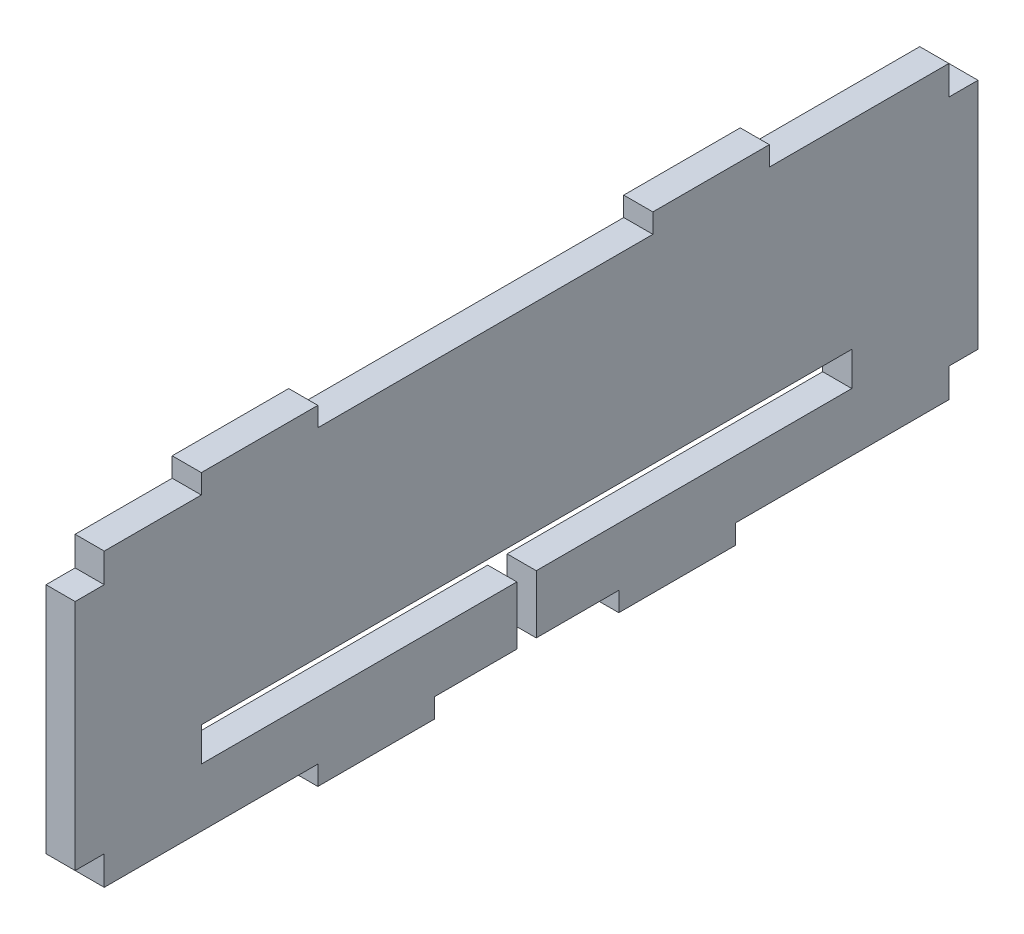
ISO-10303-21;
HEADER;
FILE_DESCRIPTION(('STEP AP214'),'2;1');
FILE_NAME('part.step','',(''),(''),'','','');
FILE_SCHEMA(('AUTOMOTIVE_DESIGN { 1 0 10303 214 1 1 1 1 }'));
ENDSEC;
DATA;
#1=APPLICATION_CONTEXT('core data for automotive mechanical design processes');
#2=APPLICATION_PROTOCOL_DEFINITION('international standard','automotive_design',2000,#1);
#3=PRODUCT_CONTEXT('',#1,'mechanical');
#4=PRODUCT('Part','Part','',(#3));
#5=PRODUCT_RELATED_PRODUCT_CATEGORY('part','',(#4));
#6=PRODUCT_DEFINITION_FORMATION('','',#4);
#7=PRODUCT_DEFINITION_CONTEXT('part definition',#1,'design');
#8=PRODUCT_DEFINITION('design','',#6,#7);
#9=PRODUCT_DEFINITION_SHAPE('','',#8);
#10=(LENGTH_UNIT() NAMED_UNIT(*) SI_UNIT(.MILLI.,.METRE.));
#11=(NAMED_UNIT(*) PLANE_ANGLE_UNIT() SI_UNIT($,.RADIAN.));
#12=(NAMED_UNIT(*) SI_UNIT($,.STERADIAN.) SOLID_ANGLE_UNIT());
#13=UNCERTAINTY_MEASURE_WITH_UNIT(LENGTH_MEASURE(1.E-05),#10,'distance_accuracy_value','');
#14=(GEOMETRIC_REPRESENTATION_CONTEXT(3) GLOBAL_UNCERTAINTY_ASSIGNED_CONTEXT((#13)) GLOBAL_UNIT_ASSIGNED_CONTEXT((#10,
#11,#12)) REPRESENTATION_CONTEXT('',''));
#15=CARTESIAN_POINT('',(0.,0.,0.));
#16=DIRECTION('',(0.,0.,1.));
#17=DIRECTION('',(1.,0.,0.));
#18=AXIS2_PLACEMENT_3D('',#15,#16,#17);
#19=CARTESIAN_POINT('',(3.,29.,0.));
#20=DIRECTION('',(0.,1.,0.));
#21=DIRECTION('',(0.,0.,1.));
#22=AXIS2_PLACEMENT_3D('',#19,#20,#21);
#23=PLANE('',#22);
#24=DIRECTION('',(0.,0.,-1.));
#25=VECTOR('',#24,1.);
#26=CARTESIAN_POINT('',(0.,29.,0.));
#27=LINE('',#26,#25);
#28=CARTESIAN_POINT('',(0.,29.,-90.));
#29=VERTEX_POINT('',#28);
#30=CARTESIAN_POINT('',(0.,29.,-93.));
#31=VERTEX_POINT('',#30);
#32=EDGE_CURVE('E294',#29,#31,#27,.T.);
#33=ORIENTED_EDGE('',*,*,#32,.F.);
#34=DIRECTION('',(-1.,0.,0.));
#35=VECTOR('',#34,1.);
#36=CARTESIAN_POINT('',(3.,29.,-90.));
#37=LINE('',#36,#35);
#38=CARTESIAN_POINT('',(3.,29.,-90.));
#39=VERTEX_POINT('',#38);
#40=EDGE_CURVE('E11',#39,#29,#37,.T.);
#41=ORIENTED_EDGE('',*,*,#40,.F.);
#42=DIRECTION('',(0.,0.,-1.));
#43=VECTOR('',#42,1.);
#44=CARTESIAN_POINT('',(3.,29.,0.));
#45=LINE('',#44,#43);
#46=CARTESIAN_POINT('',(3.,29.,-93.));
#47=VERTEX_POINT('',#46);
#48=EDGE_CURVE('E378',#39,#47,#45,.T.);
#49=ORIENTED_EDGE('',*,*,#48,.T.);
#50=DIRECTION('',(-1.,0.,0.));
#51=VECTOR('',#50,1.);
#52=CARTESIAN_POINT('',(3.,29.,-93.));
#53=LINE('',#52,#51);
#54=EDGE_CURVE('E169',#47,#31,#53,.T.);
#55=ORIENTED_EDGE('',*,*,#54,.T.);
#56=EDGE_LOOP('',(#33,#41,#49,#55));
#57=FACE_BOUND('',#56,.T.);
#58=ADVANCED_FACE('F34',(#57),#23,.T.);
#59=CARTESIAN_POINT('',(3.,0.,-90.));
#60=DIRECTION('',(0.,0.,-1.));
#61=DIRECTION('',(-1.,0.,0.));
#62=AXIS2_PLACEMENT_3D('',#59,#60,#61);
#63=PLANE('',#62);
#64=DIRECTION('',(0.,-1.,0.));
#65=VECTOR('',#64,1.);
#66=CARTESIAN_POINT('',(0.,0.,-90.));
#67=LINE('',#66,#65);
#68=CARTESIAN_POINT('',(0.,32.,-90.));
#69=VERTEX_POINT('',#68);
#70=EDGE_CURVE('E297',#69,#29,#67,.T.);
#71=ORIENTED_EDGE('',*,*,#70,.F.);
#72=DIRECTION('',(-1.,0.,0.));
#73=VECTOR('',#72,1.);
#74=CARTESIAN_POINT('',(3.,32.,-90.));
#75=LINE('',#74,#73);
#76=CARTESIAN_POINT('',(3.,32.,-90.));
#77=VERTEX_POINT('',#76);
#78=EDGE_CURVE('E42',#77,#69,#75,.T.);
#79=ORIENTED_EDGE('',*,*,#78,.F.);
#80=DIRECTION('',(0.,-1.,0.));
#81=VECTOR('',#80,1.);
#82=CARTESIAN_POINT('',(3.,0.,-90.));
#83=LINE('',#82,#81);
#84=EDGE_CURVE('E478',#77,#39,#83,.T.);
#85=ORIENTED_EDGE('',*,*,#84,.T.);
#86=ORIENTED_EDGE('',*,*,#40,.T.);
#87=EDGE_LOOP('',(#71,#79,#85,#86));
#88=FACE_BOUND('',#87,.T.);
#89=ADVANCED_FACE('F466',(#88),#63,.T.);
#90=CARTESIAN_POINT('',(3.,32.,0.));
#91=DIRECTION('',(0.,1.,0.));
#92=DIRECTION('',(0.,0.,1.));
#93=AXIS2_PLACEMENT_3D('',#90,#91,#92);
#94=PLANE('',#93);
#95=DIRECTION('',(0.,0.,-1.));
#96=VECTOR('',#95,1.);
#97=CARTESIAN_POINT('',(0.,32.,0.));
#98=LINE('',#97,#96);
#99=CARTESIAN_POINT('',(0.,32.,-71.51));
#100=VERTEX_POINT('',#99);
#101=EDGE_CURVE('E300',#100,#69,#98,.T.);
#102=ORIENTED_EDGE('',*,*,#101,.F.);
#103=DIRECTION('',(-1.,0.,0.));
#104=VECTOR('',#103,1.);
#105=CARTESIAN_POINT('',(3.,32.,-71.51));
#106=LINE('',#105,#104);
#107=CARTESIAN_POINT('',(3.,32.,-71.51));
#108=VERTEX_POINT('',#107);
#109=EDGE_CURVE('E455',#108,#100,#106,.T.);
#110=ORIENTED_EDGE('',*,*,#109,.F.);
#111=DIRECTION('',(0.,0.,-1.));
#112=VECTOR('',#111,1.);
#113=CARTESIAN_POINT('',(3.,32.,0.));
#114=LINE('',#113,#112);
#115=EDGE_CURVE('E462',#108,#77,#114,.T.);
#116=ORIENTED_EDGE('',*,*,#115,.T.);
#117=ORIENTED_EDGE('',*,*,#78,.T.);
#118=EDGE_LOOP('',(#102,#110,#116,#117));
#119=FACE_BOUND('',#118,.T.);
#120=ADVANCED_FACE('F460',(#119),#94,.T.);
#121=CARTESIAN_POINT('',(3.,0.,-71.51));
#122=DIRECTION('',(0.,0.,-1.));
#123=DIRECTION('',(-1.,0.,0.));
#124=AXIS2_PLACEMENT_3D('',#121,#122,#123);
#125=PLANE('',#124);
#126=DIRECTION('',(0.,-1.,0.));
#127=VECTOR('',#126,1.);
#128=CARTESIAN_POINT('',(0.,0.,-71.51));
#129=LINE('',#128,#127);
#130=CARTESIAN_POINT('',(0.,34.,-71.51));
#131=VERTEX_POINT('',#130);
#132=EDGE_CURVE('E303',#131,#100,#129,.T.);
#133=ORIENTED_EDGE('',*,*,#132,.F.);
#134=DIRECTION('',(-1.,0.,0.));
#135=VECTOR('',#134,1.);
#136=CARTESIAN_POINT('',(3.,34.,-71.51));
#137=LINE('',#136,#135);
#138=CARTESIAN_POINT('',(3.,34.,-71.51));
#139=VERTEX_POINT('',#138);
#140=EDGE_CURVE('E453',#139,#131,#137,.T.);
#141=ORIENTED_EDGE('',*,*,#140,.F.);
#142=DIRECTION('',(0.,-1.,0.));
#143=VECTOR('',#142,1.);
#144=CARTESIAN_POINT('',(3.,0.,-71.51));
#145=LINE('',#144,#143);
#146=EDGE_CURVE('E475',#139,#108,#145,.T.);
#147=ORIENTED_EDGE('',*,*,#146,.T.);
#148=ORIENTED_EDGE('',*,*,#109,.T.);
#149=EDGE_LOOP('',(#133,#141,#147,#148));
#150=FACE_BOUND('',#149,.T.);
#151=ADVANCED_FACE('F472',(#150),#125,.T.);
#152=CARTESIAN_POINT('',(3.,34.,0.));
#153=DIRECTION('',(0.,1.,0.));
#154=DIRECTION('',(0.,0.,1.));
#155=AXIS2_PLACEMENT_3D('',#152,#153,#154);
#156=PLANE('',#155);
#157=DIRECTION('',(0.,0.,-1.));
#158=VECTOR('',#157,1.);
#159=CARTESIAN_POINT('',(0.,34.,0.));
#160=LINE('',#159,#158);
#161=CARTESIAN_POINT('',(0.,34.,-59.51));
#162=VERTEX_POINT('',#161);
#163=EDGE_CURVE('E306',#162,#131,#160,.T.);
#164=ORIENTED_EDGE('',*,*,#163,.F.);
#165=DIRECTION('',(-1.,0.,0.));
#166=VECTOR('',#165,1.);
#167=CARTESIAN_POINT('',(3.,34.,-59.51));
#168=LINE('',#167,#166);
#169=CARTESIAN_POINT('',(3.,34.,-59.51));
#170=VERTEX_POINT('',#169);
#171=EDGE_CURVE('E451',#170,#162,#168,.T.);
#172=ORIENTED_EDGE('',*,*,#171,.F.);
#173=DIRECTION('',(0.,0.,-1.));
#174=VECTOR('',#173,1.);
#175=CARTESIAN_POINT('',(3.,34.,0.));
#176=LINE('',#175,#174);
#177=EDGE_CURVE('E480',#170,#139,#176,.T.);
#178=ORIENTED_EDGE('',*,*,#177,.T.);
#179=ORIENTED_EDGE('',*,*,#140,.T.);
#180=EDGE_LOOP('',(#164,#172,#178,#179));
#181=FACE_BOUND('',#180,.T.);
#182=ADVANCED_FACE('F576',(#181),#156,.T.);
#183=CARTESIAN_POINT('',(3.,0.,-59.51));
#184=DIRECTION('',(0.,0.,1.));
#185=DIRECTION('',(1.,0.,0.));
#186=AXIS2_PLACEMENT_3D('',#183,#184,#185);
#187=PLANE('',#186);
#188=DIRECTION('',(0.,1.,0.));
#189=VECTOR('',#188,1.);
#190=CARTESIAN_POINT('',(0.,0.,-59.51));
#191=LINE('',#190,#189);
#192=CARTESIAN_POINT('',(0.,32.,-59.51));
#193=VERTEX_POINT('',#192);
#194=EDGE_CURVE('E309',#193,#162,#191,.T.);
#195=ORIENTED_EDGE('',*,*,#194,.F.);
#196=DIRECTION('',(-1.,0.,0.));
#197=VECTOR('',#196,1.);
#198=CARTESIAN_POINT('',(3.,32.,-59.51));
#199=LINE('',#198,#197);
#200=CARTESIAN_POINT('',(3.,32.,-59.51));
#201=VERTEX_POINT('',#200);
#202=EDGE_CURVE('E449',#201,#193,#199,.T.);
#203=ORIENTED_EDGE('',*,*,#202,.F.);
#204=DIRECTION('',(0.,1.,0.));
#205=VECTOR('',#204,1.);
#206=CARTESIAN_POINT('',(3.,0.,-59.51));
#207=LINE('',#206,#205);
#208=EDGE_CURVE('E486',#201,#170,#207,.T.);
#209=ORIENTED_EDGE('',*,*,#208,.T.);
#210=ORIENTED_EDGE('',*,*,#171,.T.);
#211=EDGE_LOOP('',(#195,#203,#209,#210));
#212=FACE_BOUND('',#211,.T.);
#213=ADVANCED_FACE('F577',(#212),#187,.T.);
#214=CARTESIAN_POINT('',(3.,32.,0.));
#215=DIRECTION('',(0.,1.,0.));
#216=DIRECTION('',(0.,0.,1.));
#217=AXIS2_PLACEMENT_3D('',#214,#215,#216);
#218=PLANE('',#217);
#219=DIRECTION('',(0.,0.,-1.));
#220=VECTOR('',#219,1.);
#221=CARTESIAN_POINT('',(0.,32.,0.));
#222=LINE('',#221,#220);
#223=CARTESIAN_POINT('',(0.,32.,-25.));
#224=VERTEX_POINT('',#223);
#225=EDGE_CURVE('E313',#224,#193,#222,.T.);
#226=ORIENTED_EDGE('',*,*,#225,.F.);
#227=DIRECTION('',(-1.,0.,0.));
#228=VECTOR('',#227,1.);
#229=CARTESIAN_POINT('',(3.,32.,-25.));
#230=LINE('',#229,#228);
#231=CARTESIAN_POINT('',(3.,32.,-25.));
#232=VERTEX_POINT('',#231);
#233=EDGE_CURVE('E447',#232,#224,#230,.T.);
#234=ORIENTED_EDGE('',*,*,#233,.F.);
#235=DIRECTION('',(0.,0.,-1.));
#236=VECTOR('',#235,1.);
#237=CARTESIAN_POINT('',(3.,32.,0.));
#238=LINE('',#237,#236);
#239=EDGE_CURVE('E490',#232,#201,#238,.T.);
#240=ORIENTED_EDGE('',*,*,#239,.T.);
#241=ORIENTED_EDGE('',*,*,#202,.T.);
#242=EDGE_LOOP('',(#226,#234,#240,#241));
#243=FACE_BOUND('',#242,.T.);
#244=ADVANCED_FACE('F580',(#243),#218,.T.);
#245=CARTESIAN_POINT('',(3.,0.,-25.));
#246=DIRECTION('',(0.,0.,-1.));
#247=DIRECTION('',(-1.,0.,0.));
#248=AXIS2_PLACEMENT_3D('',#245,#246,#247);
#249=PLANE('',#248);
#250=DIRECTION('',(0.,-1.,0.));
#251=VECTOR('',#250,1.);
#252=CARTESIAN_POINT('',(0.,0.,-25.));
#253=LINE('',#252,#251);
#254=CARTESIAN_POINT('',(0.,34.,-25.));
#255=VERTEX_POINT('',#254);
#256=EDGE_CURVE('E316',#255,#224,#253,.T.);
#257=ORIENTED_EDGE('',*,*,#256,.F.);
#258=DIRECTION('',(-1.,0.,0.));
#259=VECTOR('',#258,1.);
#260=CARTESIAN_POINT('',(3.,34.,-25.));
#261=LINE('',#260,#259);
#262=CARTESIAN_POINT('',(3.,34.,-25.));
#263=VERTEX_POINT('',#262);
#264=EDGE_CURVE('E445',#263,#255,#261,.T.);
#265=ORIENTED_EDGE('',*,*,#264,.F.);
#266=DIRECTION('',(0.,-1.,0.));
#267=VECTOR('',#266,1.);
#268=CARTESIAN_POINT('',(3.,0.,-25.));
#269=LINE('',#268,#267);
#270=EDGE_CURVE('E493',#263,#232,#269,.T.);
#271=ORIENTED_EDGE('',*,*,#270,.T.);
#272=ORIENTED_EDGE('',*,*,#233,.T.);
#273=EDGE_LOOP('',(#257,#265,#271,#272));
#274=FACE_BOUND('',#273,.T.);
#275=ADVANCED_FACE('F584',(#274),#249,.T.);
#276=CARTESIAN_POINT('',(0.,34.,-13.));
#277=VERTEX_POINT('',#276);
#278=EDGE_CURVE('E310',#277,#255,#160,.T.);
#279=ORIENTED_EDGE('',*,*,#278,.F.);
#280=DIRECTION('',(-1.,0.,0.));
#281=VECTOR('',#280,1.);
#282=CARTESIAN_POINT('',(3.,34.,-13.));
#283=LINE('',#282,#281);
#284=CARTESIAN_POINT('',(3.,34.,-13.));
#285=VERTEX_POINT('',#284);
#286=EDGE_CURVE('E443',#285,#277,#283,.T.);
#287=ORIENTED_EDGE('',*,*,#286,.F.);
#288=EDGE_CURVE('E487',#285,#263,#176,.T.);
#289=ORIENTED_EDGE('',*,*,#288,.T.);
#290=ORIENTED_EDGE('',*,*,#264,.T.);
#291=EDGE_LOOP('',(#279,#287,#289,#290));
#292=FACE_BOUND('',#291,.T.);
#293=ADVANCED_FACE('F588',(#292),#156,.T.);
#294=CARTESIAN_POINT('',(3.,0.,-13.));
#295=DIRECTION('',(0.,0.,1.));
#296=DIRECTION('',(1.,0.,0.));
#297=AXIS2_PLACEMENT_3D('',#294,#295,#296);
#298=PLANE('',#297);
#299=DIRECTION('',(0.,1.,0.));
#300=VECTOR('',#299,1.);
#301=CARTESIAN_POINT('',(0.,0.,-13.));
#302=LINE('',#301,#300);
#303=CARTESIAN_POINT('',(0.,32.,-13.));
#304=VERTEX_POINT('',#303);
#305=EDGE_CURVE('E319',#304,#277,#302,.T.);
#306=ORIENTED_EDGE('',*,*,#305,.F.);
#307=DIRECTION('',(-1.,0.,0.));
#308=VECTOR('',#307,1.);
#309=CARTESIAN_POINT('',(3.,32.,-13.));
#310=LINE('',#309,#308);
#311=CARTESIAN_POINT('',(3.,32.,-13.));
#312=VERTEX_POINT('',#311);
#313=EDGE_CURVE('E441',#312,#304,#310,.T.);
#314=ORIENTED_EDGE('',*,*,#313,.F.);
#315=DIRECTION('',(0.,1.,0.));
#316=VECTOR('',#315,1.);
#317=CARTESIAN_POINT('',(3.,0.,-13.));
#318=LINE('',#317,#316);
#319=EDGE_CURVE('E496',#312,#285,#318,.T.);
#320=ORIENTED_EDGE('',*,*,#319,.T.);
#321=ORIENTED_EDGE('',*,*,#286,.T.);
#322=EDGE_LOOP('',(#306,#314,#320,#321));
#323=FACE_BOUND('',#322,.T.);
#324=ADVANCED_FACE('F592',(#323),#298,.T.);
#325=CARTESIAN_POINT('',(3.,32.,0.));
#326=DIRECTION('',(0.,1.,0.));
#327=DIRECTION('',(0.,0.,1.));
#328=AXIS2_PLACEMENT_3D('',#325,#326,#327);
#329=PLANE('',#328);
#330=DIRECTION('',(0.,0.,-1.));
#331=VECTOR('',#330,1.);
#332=CARTESIAN_POINT('',(0.,32.,0.));
#333=LINE('',#332,#331);
#334=CARTESIAN_POINT('',(0.,32.,-2.99999999999999));
#335=VERTEX_POINT('',#334);
#336=EDGE_CURVE('E322',#335,#304,#333,.T.);
#337=ORIENTED_EDGE('',*,*,#336,.F.);
#338=DIRECTION('',(-1.,0.,0.));
#339=VECTOR('',#338,1.);
#340=CARTESIAN_POINT('',(3.,32.,-2.99999999999999));
#341=LINE('',#340,#339);
#342=CARTESIAN_POINT('',(3.,32.,-2.99999999999999));
#343=VERTEX_POINT('',#342);
#344=EDGE_CURVE('E439',#343,#335,#341,.T.);
#345=ORIENTED_EDGE('',*,*,#344,.F.);
#346=DIRECTION('',(0.,0.,-1.));
#347=VECTOR('',#346,1.);
#348=CARTESIAN_POINT('',(3.,32.,0.));
#349=LINE('',#348,#347);
#350=EDGE_CURVE('E499',#343,#312,#349,.T.);
#351=ORIENTED_EDGE('',*,*,#350,.T.);
#352=ORIENTED_EDGE('',*,*,#313,.T.);
#353=EDGE_LOOP('',(#337,#345,#351,#352));
#354=FACE_BOUND('',#353,.T.);
#355=ADVANCED_FACE('F596',(#354),#329,.T.);
#356=CARTESIAN_POINT('',(3.,0.,-2.99999999999999));
#357=DIRECTION('',(0.,0.,1.));
#358=DIRECTION('',(1.,0.,0.));
#359=AXIS2_PLACEMENT_3D('',#356,#357,#358);
#360=PLANE('',#359);
#361=DIRECTION('',(0.,1.,0.));
#362=VECTOR('',#361,1.);
#363=CARTESIAN_POINT('',(0.,0.,-2.99999999999999));
#364=LINE('',#363,#362);
#365=CARTESIAN_POINT('',(0.,29.,-2.99999999999999));
#366=VERTEX_POINT('',#365);
#367=EDGE_CURVE('E325',#366,#335,#364,.T.);
#368=ORIENTED_EDGE('',*,*,#367,.F.);
#369=DIRECTION('',(-1.,0.,0.));
#370=VECTOR('',#369,1.);
#371=CARTESIAN_POINT('',(3.,29.,-2.99999999999999));
#372=LINE('',#371,#370);
#373=CARTESIAN_POINT('',(3.,29.,-2.99999999999999));
#374=VERTEX_POINT('',#373);
#375=EDGE_CURVE('E437',#374,#366,#372,.T.);
#376=ORIENTED_EDGE('',*,*,#375,.F.);
#377=DIRECTION('',(0.,1.,0.));
#378=VECTOR('',#377,1.);
#379=CARTESIAN_POINT('',(3.,0.,-2.99999999999999));
#380=LINE('',#379,#378);
#381=EDGE_CURVE('E502',#374,#343,#380,.T.);
#382=ORIENTED_EDGE('',*,*,#381,.T.);
#383=ORIENTED_EDGE('',*,*,#344,.T.);
#384=EDGE_LOOP('',(#368,#376,#382,#383));
#385=FACE_BOUND('',#384,.T.);
#386=ADVANCED_FACE('F600',(#385),#360,.T.);
#387=CARTESIAN_POINT('',(3.,29.,0.));
#388=DIRECTION('',(0.,1.,0.));
#389=DIRECTION('',(0.,0.,1.));
#390=AXIS2_PLACEMENT_3D('',#387,#388,#389);
#391=PLANE('',#390);
#392=DIRECTION('',(0.,0.,-1.));
#393=VECTOR('',#392,1.);
#394=CARTESIAN_POINT('',(0.,29.,0.));
#395=LINE('',#394,#393);
#396=CARTESIAN_POINT('',(0.,29.,0.));
#397=VERTEX_POINT('',#396);
#398=EDGE_CURVE('E328',#397,#366,#395,.T.);
#399=ORIENTED_EDGE('',*,*,#398,.F.);
#400=DIRECTION('',(-1.,0.,0.));
#401=VECTOR('',#400,1.);
#402=CARTESIAN_POINT('',(3.,29.,0.));
#403=LINE('',#402,#401);
#404=CARTESIAN_POINT('',(3.,29.,0.));
#405=VERTEX_POINT('',#404);
#406=EDGE_CURVE('E435',#405,#397,#403,.T.);
#407=ORIENTED_EDGE('',*,*,#406,.F.);
#408=DIRECTION('',(0.,0.,-1.));
#409=VECTOR('',#408,1.);
#410=CARTESIAN_POINT('',(3.,29.,0.));
#411=LINE('',#410,#409);
#412=EDGE_CURVE('E505',#405,#374,#411,.T.);
#413=ORIENTED_EDGE('',*,*,#412,.T.);
#414=ORIENTED_EDGE('',*,*,#375,.T.);
#415=EDGE_LOOP('',(#399,#407,#413,#414));
#416=FACE_BOUND('',#415,.T.);
#417=ADVANCED_FACE('F604',(#416),#391,.T.);
#418=CARTESIAN_POINT('',(3.,0.,0.));
#419=DIRECTION('',(0.,0.,-1.));
#420=DIRECTION('',(-1.,0.,0.));
#421=AXIS2_PLACEMENT_3D('',#418,#419,#420);
#422=PLANE('',#421);
#423=DIRECTION('',(0.,-1.,0.));
#424=VECTOR('',#423,1.);
#425=CARTESIAN_POINT('',(0.,0.,0.));
#426=LINE('',#425,#424);
#427=CARTESIAN_POINT('',(0.,5.,0.));
#428=VERTEX_POINT('',#427);
#429=EDGE_CURVE('E331',#397,#428,#426,.T.);
#430=ORIENTED_EDGE('',*,*,#429,.T.);
#431=DIRECTION('',(-1.,0.,0.));
#432=VECTOR('',#431,1.);
#433=CARTESIAN_POINT('',(3.,5.,0.));
#434=LINE('',#433,#432);
#435=CARTESIAN_POINT('',(3.,5.,0.));
#436=VERTEX_POINT('',#435);
#437=EDGE_CURVE('E432',#436,#428,#434,.T.);
#438=ORIENTED_EDGE('',*,*,#437,.F.);
#439=DIRECTION('',(0.,-1.,0.));
#440=VECTOR('',#439,1.);
#441=CARTESIAN_POINT('',(3.,0.,0.));
#442=LINE('',#441,#440);
#443=EDGE_CURVE('E508',#405,#436,#442,.T.);
#444=ORIENTED_EDGE('',*,*,#443,.F.);
#445=ORIENTED_EDGE('',*,*,#406,.T.);
#446=EDGE_LOOP('',(#430,#438,#444,#445));
#447=FACE_BOUND('',#446,.T.);
#448=ADVANCED_FACE('F608',(#447),#422,.F.);
#449=CARTESIAN_POINT('',(3.,5.,0.));
#450=DIRECTION('',(0.,1.,0.));
#451=DIRECTION('',(0.,0.,1.));
#452=AXIS2_PLACEMENT_3D('',#449,#450,#451);
#453=PLANE('',#452);
#454=DIRECTION('',(0.,0.,-1.));
#455=VECTOR('',#454,1.);
#456=CARTESIAN_POINT('',(0.,5.,0.));
#457=LINE('',#456,#455);
#458=CARTESIAN_POINT('',(0.,5.,-3.));
#459=VERTEX_POINT('',#458);
#460=EDGE_CURVE('E333',#428,#459,#457,.T.);
#461=ORIENTED_EDGE('',*,*,#460,.T.);
#462=DIRECTION('',(-1.,0.,0.));
#463=VECTOR('',#462,1.);
#464=CARTESIAN_POINT('',(3.,5.,-3.));
#465=LINE('',#464,#463);
#466=CARTESIAN_POINT('',(3.,5.,-3.));
#467=VERTEX_POINT('',#466);
#468=EDGE_CURVE('E429',#467,#459,#465,.T.);
#469=ORIENTED_EDGE('',*,*,#468,.F.);
#470=DIRECTION('',(0.,0.,-1.));
#471=VECTOR('',#470,1.);
#472=CARTESIAN_POINT('',(3.,5.,0.));
#473=LINE('',#472,#471);
#474=EDGE_CURVE('E510',#436,#467,#473,.T.);
#475=ORIENTED_EDGE('',*,*,#474,.F.);
#476=ORIENTED_EDGE('',*,*,#437,.T.);
#477=EDGE_LOOP('',(#461,#469,#475,#476));
#478=FACE_BOUND('',#477,.T.);
#479=ADVANCED_FACE('F612',(#478),#453,.F.);
#480=CARTESIAN_POINT('',(3.,0.,-3.));
#481=DIRECTION('',(0.,0.,-1.));
#482=DIRECTION('',(0.,1.,0.));
#483=AXIS2_PLACEMENT_3D('',#480,#481,#482);
#484=PLANE('',#483);
#485=DIRECTION('',(0.,-1.,0.));
#486=VECTOR('',#485,1.);
#487=CARTESIAN_POINT('',(0.,0.,-3.));
#488=LINE('',#487,#486);
#489=CARTESIAN_POINT('',(0.,2.,-3.));
#490=VERTEX_POINT('',#489);
#491=EDGE_CURVE('E335',#459,#490,#488,.T.);
#492=ORIENTED_EDGE('',*,*,#491,.T.);
#493=DIRECTION('',(-1.,0.,0.));
#494=VECTOR('',#493,1.);
#495=CARTESIAN_POINT('',(3.,2.,-3.));
#496=LINE('',#495,#494);
#497=CARTESIAN_POINT('',(3.,2.,-3.));
#498=VERTEX_POINT('',#497);
#499=EDGE_CURVE('E426',#498,#490,#496,.T.);
#500=ORIENTED_EDGE('',*,*,#499,.F.);
#501=DIRECTION('',(0.,-1.,0.));
#502=VECTOR('',#501,1.);
#503=CARTESIAN_POINT('',(3.,0.,-3.));
#504=LINE('',#503,#502);
#505=EDGE_CURVE('E512',#467,#498,#504,.T.);
#506=ORIENTED_EDGE('',*,*,#505,.F.);
#507=ORIENTED_EDGE('',*,*,#468,.T.);
#508=EDGE_LOOP('',(#492,#500,#506,#507));
#509=FACE_BOUND('',#508,.T.);
#510=ADVANCED_FACE('F616',(#509),#484,.F.);
#511=CARTESIAN_POINT('',(3.,2.,0.));
#512=DIRECTION('',(0.,1.,0.));
#513=DIRECTION('',(0.,0.,1.));
#514=AXIS2_PLACEMENT_3D('',#511,#512,#513);
#515=PLANE('',#514);
#516=DIRECTION('',(0.,0.,-1.));
#517=VECTOR('',#516,1.);
#518=CARTESIAN_POINT('',(0.,2.,0.));
#519=LINE('',#518,#517);
#520=CARTESIAN_POINT('',(0.,2.,-25.));
#521=VERTEX_POINT('',#520);
#522=EDGE_CURVE('E337',#490,#521,#519,.T.);
#523=ORIENTED_EDGE('',*,*,#522,.T.);
#524=DIRECTION('',(-1.,0.,0.));
#525=VECTOR('',#524,1.);
#526=CARTESIAN_POINT('',(3.,2.,-25.));
#527=LINE('',#526,#525);
#528=CARTESIAN_POINT('',(3.,2.,-25.));
#529=VERTEX_POINT('',#528);
#530=EDGE_CURVE('E423',#529,#521,#527,.T.);
#531=ORIENTED_EDGE('',*,*,#530,.F.);
#532=DIRECTION('',(0.,0.,-1.));
#533=VECTOR('',#532,1.);
#534=CARTESIAN_POINT('',(3.,2.,0.));
#535=LINE('',#534,#533);
#536=EDGE_CURVE('E514',#498,#529,#535,.T.);
#537=ORIENTED_EDGE('',*,*,#536,.F.);
#538=ORIENTED_EDGE('',*,*,#499,.T.);
#539=EDGE_LOOP('',(#523,#531,#537,#538));
#540=FACE_BOUND('',#539,.T.);
#541=ADVANCED_FACE('F620',(#540),#515,.F.);
#542=CARTESIAN_POINT('',(3.,0.,-25.));
#543=DIRECTION('',(0.,0.,-1.));
#544=DIRECTION('',(-1.,0.,0.));
#545=AXIS2_PLACEMENT_3D('',#542,#543,#544);
#546=PLANE('',#545);
#547=DIRECTION('',(0.,-1.,0.));
#548=VECTOR('',#547,1.);
#549=CARTESIAN_POINT('',(0.,0.,-25.));
#550=LINE('',#549,#548);
#551=CARTESIAN_POINT('',(0.,0.,-25.));
#552=VERTEX_POINT('',#551);
#553=EDGE_CURVE('E339',#521,#552,#550,.T.);
#554=ORIENTED_EDGE('',*,*,#553,.T.);
#555=DIRECTION('',(-1.,0.,0.));
#556=VECTOR('',#555,1.);
#557=CARTESIAN_POINT('',(3.,0.,-25.));
#558=LINE('',#557,#556);
#559=CARTESIAN_POINT('',(3.,0.,-25.));
#560=VERTEX_POINT('',#559);
#561=EDGE_CURVE('E420',#560,#552,#558,.T.);
#562=ORIENTED_EDGE('',*,*,#561,.F.);
#563=DIRECTION('',(0.,-1.,0.));
#564=VECTOR('',#563,1.);
#565=CARTESIAN_POINT('',(3.,0.,-25.));
#566=LINE('',#565,#564);
#567=EDGE_CURVE('E516',#529,#560,#566,.T.);
#568=ORIENTED_EDGE('',*,*,#567,.F.);
#569=ORIENTED_EDGE('',*,*,#530,.T.);
#570=EDGE_LOOP('',(#554,#562,#568,#569));
#571=FACE_BOUND('',#570,.T.);
#572=ADVANCED_FACE('F624',(#571),#546,.F.);
#573=CARTESIAN_POINT('',(3.,0.,0.));
#574=DIRECTION('',(0.,1.,0.));
#575=DIRECTION('',(0.,0.,1.));
#576=AXIS2_PLACEMENT_3D('',#573,#574,#575);
#577=PLANE('',#576);
#578=DIRECTION('',(0.,0.,-1.));
#579=VECTOR('',#578,1.);
#580=CARTESIAN_POINT('',(0.,0.,0.));
#581=LINE('',#580,#579);
#582=CARTESIAN_POINT('',(0.,0.,-37.));
#583=VERTEX_POINT('',#582);
#584=EDGE_CURVE('E341',#552,#583,#581,.T.);
#585=ORIENTED_EDGE('',*,*,#584,.T.);
#586=DIRECTION('',(-1.,0.,0.));
#587=VECTOR('',#586,1.);
#588=CARTESIAN_POINT('',(3.,0.,-37.));
#589=LINE('',#588,#587);
#590=CARTESIAN_POINT('',(3.,0.,-37.));
#591=VERTEX_POINT('',#590);
#592=EDGE_CURVE('E417',#591,#583,#589,.T.);
#593=ORIENTED_EDGE('',*,*,#592,.F.);
#594=DIRECTION('',(0.,0.,-1.));
#595=VECTOR('',#594,1.);
#596=CARTESIAN_POINT('',(3.,0.,0.));
#597=LINE('',#596,#595);
#598=EDGE_CURVE('E518',#560,#591,#597,.T.);
#599=ORIENTED_EDGE('',*,*,#598,.F.);
#600=ORIENTED_EDGE('',*,*,#561,.T.);
#601=EDGE_LOOP('',(#585,#593,#599,#600));
#602=FACE_BOUND('',#601,.T.);
#603=ADVANCED_FACE('F628',(#602),#577,.F.);
#604=CARTESIAN_POINT('',(3.,0.,-37.));
#605=DIRECTION('',(0.,0.,1.));
#606=DIRECTION('',(1.,0.,0.));
#607=AXIS2_PLACEMENT_3D('',#604,#605,#606);
#608=PLANE('',#607);
#609=DIRECTION('',(0.,1.,0.));
#610=VECTOR('',#609,1.);
#611=CARTESIAN_POINT('',(0.,0.,-37.));
#612=LINE('',#611,#610);
#613=CARTESIAN_POINT('',(0.,2.,-37.));
#614=VERTEX_POINT('',#613);
#615=EDGE_CURVE('E343',#583,#614,#612,.T.);
#616=ORIENTED_EDGE('',*,*,#615,.T.);
#617=DIRECTION('',(-1.,0.,0.));
#618=VECTOR('',#617,1.);
#619=CARTESIAN_POINT('',(3.,2.,-37.));
#620=LINE('',#619,#618);
#621=CARTESIAN_POINT('',(3.,2.,-37.));
#622=VERTEX_POINT('',#621);
#623=EDGE_CURVE('E415',#622,#614,#620,.T.);
#624=ORIENTED_EDGE('',*,*,#623,.F.);
#625=DIRECTION('',(0.,1.,0.));
#626=VECTOR('',#625,1.);
#627=CARTESIAN_POINT('',(3.,0.,-37.));
#628=LINE('',#627,#626);
#629=EDGE_CURVE('E520',#591,#622,#628,.T.);
#630=ORIENTED_EDGE('',*,*,#629,.F.);
#631=ORIENTED_EDGE('',*,*,#592,.T.);
#632=EDGE_LOOP('',(#616,#624,#630,#631));
#633=FACE_BOUND('',#632,.T.);
#634=ADVANCED_FACE('F630',(#633),#608,.F.);
#635=CARTESIAN_POINT('',(3.,2.,0.));
#636=DIRECTION('',(0.,-1.,0.));
#637=DIRECTION('',(0.,0.,-1.));
#638=AXIS2_PLACEMENT_3D('',#635,#636,#637);
#639=PLANE('',#638);
#640=DIRECTION('',(0.,0.,1.));
#641=VECTOR('',#640,1.);
#642=CARTESIAN_POINT('',(0.,2.,0.));
#643=LINE('',#642,#641);
#644=CARTESIAN_POINT('',(0.,2.,-45.5));
#645=VERTEX_POINT('',#644);
#646=EDGE_CURVE('E347',#645,#614,#643,.T.);
#647=ORIENTED_EDGE('',*,*,#646,.F.);
#648=DIRECTION('',(-1.,0.,0.));
#649=VECTOR('',#648,1.);
#650=CARTESIAN_POINT('',(3.,2.,-45.5));
#651=LINE('',#650,#649);
#652=CARTESIAN_POINT('',(3.,2.,-45.5));
#653=VERTEX_POINT('',#652);
#654=EDGE_CURVE('E413',#653,#645,#651,.T.);
#655=ORIENTED_EDGE('',*,*,#654,.F.);
#656=DIRECTION('',(0.,0.,1.));
#657=VECTOR('',#656,1.);
#658=CARTESIAN_POINT('',(3.,2.,0.));
#659=LINE('',#658,#657);
#660=EDGE_CURVE('E523',#653,#622,#659,.T.);
#661=ORIENTED_EDGE('',*,*,#660,.T.);
#662=ORIENTED_EDGE('',*,*,#623,.T.);
#663=EDGE_LOOP('',(#647,#655,#661,#662));
#664=FACE_BOUND('',#663,.T.);
#665=ADVANCED_FACE('F633',(#664),#639,.T.);
#666=CARTESIAN_POINT('',(3.,0.,-45.5));
#667=DIRECTION('',(0.,0.,-1.));
#668=DIRECTION('',(-1.,0.,0.));
#669=AXIS2_PLACEMENT_3D('',#666,#667,#668);
#670=PLANE('',#669);
#671=DIRECTION('',(0.,-1.,0.));
#672=VECTOR('',#671,1.);
#673=CARTESIAN_POINT('',(0.,0.,-45.5));
#674=LINE('',#673,#672);
#675=CARTESIAN_POINT('',(0.,8.,-45.5));
#676=VERTEX_POINT('',#675);
#677=EDGE_CURVE('E350',#676,#645,#674,.T.);
#678=ORIENTED_EDGE('',*,*,#677,.F.);
#679=DIRECTION('',(-1.,0.,0.));
#680=VECTOR('',#679,1.);
#681=CARTESIAN_POINT('',(3.,8.,-45.5));
#682=LINE('',#681,#680);
#683=CARTESIAN_POINT('',(3.,8.,-45.5));
#684=VERTEX_POINT('',#683);
#685=EDGE_CURVE('E411',#684,#676,#682,.T.);
#686=ORIENTED_EDGE('',*,*,#685,.F.);
#687=DIRECTION('',(0.,-1.,0.));
#688=VECTOR('',#687,1.);
#689=CARTESIAN_POINT('',(3.,0.,-45.5));
#690=LINE('',#689,#688);
#691=EDGE_CURVE('E526',#684,#653,#690,.T.);
#692=ORIENTED_EDGE('',*,*,#691,.T.);
#693=ORIENTED_EDGE('',*,*,#654,.T.);
#694=EDGE_LOOP('',(#678,#686,#692,#693));
#695=FACE_BOUND('',#694,.T.);
#696=ADVANCED_FACE('F637',(#695),#670,.T.);
#697=CARTESIAN_POINT('',(3.,8.,0.));
#698=DIRECTION('',(0.,1.,0.));
#699=DIRECTION('',(0.,0.,1.));
#700=AXIS2_PLACEMENT_3D('',#697,#698,#699);
#701=PLANE('',#700);
#702=DIRECTION('',(0.,0.,-1.));
#703=VECTOR('',#702,1.);
#704=CARTESIAN_POINT('',(0.,8.,0.));
#705=LINE('',#704,#703);
#706=CARTESIAN_POINT('',(0.,8.,-13.));
#707=VERTEX_POINT('',#706);
#708=EDGE_CURVE('E353',#707,#676,#705,.T.);
#709=ORIENTED_EDGE('',*,*,#708,.F.);
#710=DIRECTION('',(-1.,0.,0.));
#711=VECTOR('',#710,1.);
#712=CARTESIAN_POINT('',(3.,8.,-13.));
#713=LINE('',#712,#711);
#714=CARTESIAN_POINT('',(3.,8.,-13.));
#715=VERTEX_POINT('',#714);
#716=EDGE_CURVE('E409',#715,#707,#713,.T.);
#717=ORIENTED_EDGE('',*,*,#716,.F.);
#718=DIRECTION('',(0.,0.,-1.));
#719=VECTOR('',#718,1.);
#720=CARTESIAN_POINT('',(3.,8.,0.));
#721=LINE('',#720,#719);
#722=EDGE_CURVE('E529',#715,#684,#721,.T.);
#723=ORIENTED_EDGE('',*,*,#722,.T.);
#724=ORIENTED_EDGE('',*,*,#685,.T.);
#725=EDGE_LOOP('',(#709,#717,#723,#724));
#726=FACE_BOUND('',#725,.T.);
#727=ADVANCED_FACE('F641',(#726),#701,.T.);
#728=CARTESIAN_POINT('',(3.,0.,-13.));
#729=DIRECTION('',(0.,0.,1.));
#730=DIRECTION('',(1.,0.,0.));
#731=AXIS2_PLACEMENT_3D('',#728,#729,#730);
#732=PLANE('',#731);
#733=DIRECTION('',(0.,1.,0.));
#734=VECTOR('',#733,1.);
#735=CARTESIAN_POINT('',(0.,0.,-13.));
#736=LINE('',#735,#734);
#737=CARTESIAN_POINT('',(0.,11.5,-13.));
#738=VERTEX_POINT('',#737);
#739=EDGE_CURVE('E356',#707,#738,#736,.T.);
#740=ORIENTED_EDGE('',*,*,#739,.T.);
#741=DIRECTION('',(-1.,0.,0.));
#742=VECTOR('',#741,1.);
#743=CARTESIAN_POINT('',(3.,11.5,-13.));
#744=LINE('',#743,#742);
#745=CARTESIAN_POINT('',(3.,11.5,-13.));
#746=VERTEX_POINT('',#745);
#747=EDGE_CURVE('E406',#746,#738,#744,.T.);
#748=ORIENTED_EDGE('',*,*,#747,.F.);
#749=DIRECTION('',(0.,1.,0.));
#750=VECTOR('',#749,1.);
#751=CARTESIAN_POINT('',(3.,0.,-13.));
#752=LINE('',#751,#750);
#753=EDGE_CURVE('E532',#715,#746,#752,.T.);
#754=ORIENTED_EDGE('',*,*,#753,.F.);
#755=ORIENTED_EDGE('',*,*,#716,.T.);
#756=EDGE_LOOP('',(#740,#748,#754,#755));
#757=FACE_BOUND('',#756,.T.);
#758=ADVANCED_FACE('F645',(#757),#732,.F.);
#759=CARTESIAN_POINT('',(3.,11.5,0.));
#760=DIRECTION('',(0.,1.,0.));
#761=DIRECTION('',(0.,0.,1.));
#762=AXIS2_PLACEMENT_3D('',#759,#760,#761);
#763=PLANE('',#762);
#764=DIRECTION('',(0.,0.,-1.));
#765=VECTOR('',#764,1.);
#766=CARTESIAN_POINT('',(0.,11.5,0.));
#767=LINE('',#766,#765);
#768=CARTESIAN_POINT('',(0.,11.5,-80.));
#769=VERTEX_POINT('',#768);
#770=EDGE_CURVE('E358',#738,#769,#767,.T.);
#771=ORIENTED_EDGE('',*,*,#770,.T.);
#772=DIRECTION('',(-1.,0.,0.));
#773=VECTOR('',#772,1.);
#774=CARTESIAN_POINT('',(3.,11.5,-80.));
#775=LINE('',#774,#773);
#776=CARTESIAN_POINT('',(3.,11.5,-80.));
#777=VERTEX_POINT('',#776);
#778=EDGE_CURVE('E403',#777,#769,#775,.T.);
#779=ORIENTED_EDGE('',*,*,#778,.F.);
#780=DIRECTION('',(0.,0.,-1.));
#781=VECTOR('',#780,1.);
#782=CARTESIAN_POINT('',(3.,11.5,0.));
#783=LINE('',#782,#781);
#784=EDGE_CURVE('E534',#746,#777,#783,.T.);
#785=ORIENTED_EDGE('',*,*,#784,.F.);
#786=ORIENTED_EDGE('',*,*,#747,.T.);
#787=EDGE_LOOP('',(#771,#779,#785,#786));
#788=FACE_BOUND('',#787,.T.);
#789=ADVANCED_FACE('F649',(#788),#763,.F.);
#790=CARTESIAN_POINT('',(3.,0.,-80.));
#791=DIRECTION('',(0.,0.,-1.));
#792=DIRECTION('',(-1.,0.,0.));
#793=AXIS2_PLACEMENT_3D('',#790,#791,#792);
#794=PLANE('',#793);
#795=DIRECTION('',(0.,-1.,0.));
#796=VECTOR('',#795,1.);
#797=CARTESIAN_POINT('',(0.,0.,-80.));
#798=LINE('',#797,#796);
#799=CARTESIAN_POINT('',(0.,8.,-80.));
#800=VERTEX_POINT('',#799);
#801=EDGE_CURVE('E360',#769,#800,#798,.T.);
#802=ORIENTED_EDGE('',*,*,#801,.T.);
#803=DIRECTION('',(-1.,0.,0.));
#804=VECTOR('',#803,1.);
#805=CARTESIAN_POINT('',(3.,8.,-80.));
#806=LINE('',#805,#804);
#807=CARTESIAN_POINT('',(3.,8.,-80.));
#808=VERTEX_POINT('',#807);
#809=EDGE_CURVE('E400',#808,#800,#806,.T.);
#810=ORIENTED_EDGE('',*,*,#809,.F.);
#811=DIRECTION('',(0.,-1.,0.));
#812=VECTOR('',#811,1.);
#813=CARTESIAN_POINT('',(3.,0.,-80.));
#814=LINE('',#813,#812);
#815=EDGE_CURVE('E536',#777,#808,#814,.T.);
#816=ORIENTED_EDGE('',*,*,#815,.F.);
#817=ORIENTED_EDGE('',*,*,#778,.T.);
#818=EDGE_LOOP('',(#802,#810,#816,#817));
#819=FACE_BOUND('',#818,.T.);
#820=ADVANCED_FACE('F653',(#819),#794,.F.);
#821=CARTESIAN_POINT('',(3.,7.99999999999999,0.));
#822=DIRECTION('',(0.,-1.,0.));
#823=DIRECTION('',(0.,0.,-1.));
#824=AXIS2_PLACEMENT_3D('',#821,#822,#823);
#825=PLANE('',#824);
#826=DIRECTION('',(0.,0.,1.));
#827=VECTOR('',#826,1.);
#828=CARTESIAN_POINT('',(0.,7.99999999999999,0.));
#829=LINE('',#828,#827);
#830=CARTESIAN_POINT('',(0.,8.,-47.5));
#831=VERTEX_POINT('',#830);
#832=EDGE_CURVE('E362',#800,#831,#829,.T.);
#833=ORIENTED_EDGE('',*,*,#832,.T.);
#834=DIRECTION('',(-1.,0.,0.));
#835=VECTOR('',#834,1.);
#836=CARTESIAN_POINT('',(3.,8.,-47.5));
#837=LINE('',#836,#835);
#838=CARTESIAN_POINT('',(3.,8.,-47.5));
#839=VERTEX_POINT('',#838);
#840=EDGE_CURVE('E397',#839,#831,#837,.T.);
#841=ORIENTED_EDGE('',*,*,#840,.F.);
#842=DIRECTION('',(0.,0.,1.));
#843=VECTOR('',#842,1.);
#844=CARTESIAN_POINT('',(3.,7.99999999999999,0.));
#845=LINE('',#844,#843);
#846=EDGE_CURVE('E538',#808,#839,#845,.T.);
#847=ORIENTED_EDGE('',*,*,#846,.F.);
#848=ORIENTED_EDGE('',*,*,#809,.T.);
#849=EDGE_LOOP('',(#833,#841,#847,#848));
#850=FACE_BOUND('',#849,.T.);
#851=ADVANCED_FACE('F657',(#850),#825,.F.);
#852=CARTESIAN_POINT('',(3.,0.,-47.5));
#853=DIRECTION('',(0.,0.,-1.));
#854=DIRECTION('',(-1.,0.,0.));
#855=AXIS2_PLACEMENT_3D('',#852,#853,#854);
#856=PLANE('',#855);
#857=DIRECTION('',(0.,-1.,0.));
#858=VECTOR('',#857,1.);
#859=CARTESIAN_POINT('',(0.,0.,-47.5));
#860=LINE('',#859,#858);
#861=CARTESIAN_POINT('',(0.,2.,-47.5));
#862=VERTEX_POINT('',#861);
#863=EDGE_CURVE('E364',#831,#862,#860,.T.);
#864=ORIENTED_EDGE('',*,*,#863,.T.);
#865=DIRECTION('',(-1.,0.,0.));
#866=VECTOR('',#865,1.);
#867=CARTESIAN_POINT('',(3.,2.,-47.5));
#868=LINE('',#867,#866);
#869=CARTESIAN_POINT('',(3.,2.,-47.5));
#870=VERTEX_POINT('',#869);
#871=EDGE_CURVE('E394',#870,#862,#868,.T.);
#872=ORIENTED_EDGE('',*,*,#871,.F.);
#873=DIRECTION('',(0.,-1.,0.));
#874=VECTOR('',#873,1.);
#875=CARTESIAN_POINT('',(3.,0.,-47.5));
#876=LINE('',#875,#874);
#877=EDGE_CURVE('E540',#839,#870,#876,.T.);
#878=ORIENTED_EDGE('',*,*,#877,.F.);
#879=ORIENTED_EDGE('',*,*,#840,.T.);
#880=EDGE_LOOP('',(#864,#872,#878,#879));
#881=FACE_BOUND('',#880,.T.);
#882=ADVANCED_FACE('F661',(#881),#856,.F.);
#883=CARTESIAN_POINT('',(3.,2.,0.));
#884=DIRECTION('',(0.,1.,0.));
#885=DIRECTION('',(0.,0.,1.));
#886=AXIS2_PLACEMENT_3D('',#883,#884,#885);
#887=PLANE('',#886);
#888=DIRECTION('',(0.,0.,-1.));
#889=VECTOR('',#888,1.);
#890=CARTESIAN_POINT('',(0.,2.,0.));
#891=LINE('',#890,#889);
#892=CARTESIAN_POINT('',(0.,2.,-56.));
#893=VERTEX_POINT('',#892);
#894=EDGE_CURVE('E366',#862,#893,#891,.T.);
#895=ORIENTED_EDGE('',*,*,#894,.T.);
#896=DIRECTION('',(-1.,0.,0.));
#897=VECTOR('',#896,1.);
#898=CARTESIAN_POINT('',(3.,2.,-56.));
#899=LINE('',#898,#897);
#900=CARTESIAN_POINT('',(3.,2.,-56.));
#901=VERTEX_POINT('',#900);
#902=EDGE_CURVE('E391',#901,#893,#899,.T.);
#903=ORIENTED_EDGE('',*,*,#902,.F.);
#904=DIRECTION('',(0.,0.,-1.));
#905=VECTOR('',#904,1.);
#906=CARTESIAN_POINT('',(3.,2.,0.));
#907=LINE('',#906,#905);
#908=EDGE_CURVE('E542',#870,#901,#907,.T.);
#909=ORIENTED_EDGE('',*,*,#908,.F.);
#910=ORIENTED_EDGE('',*,*,#871,.T.);
#911=EDGE_LOOP('',(#895,#903,#909,#910));
#912=FACE_BOUND('',#911,.T.);
#913=ADVANCED_FACE('F665',(#912),#887,.F.);
#914=CARTESIAN_POINT('',(3.,0.,-56.));
#915=DIRECTION('',(0.,0.,-1.));
#916=DIRECTION('',(-1.,0.,0.));
#917=AXIS2_PLACEMENT_3D('',#914,#915,#916);
#918=PLANE('',#917);
#919=DIRECTION('',(0.,-1.,0.));
#920=VECTOR('',#919,1.);
#921=CARTESIAN_POINT('',(0.,0.,-56.));
#922=LINE('',#921,#920);
#923=CARTESIAN_POINT('',(0.,0.,-56.));
#924=VERTEX_POINT('',#923);
#925=EDGE_CURVE('E368',#893,#924,#922,.T.);
#926=ORIENTED_EDGE('',*,*,#925,.T.);
#927=DIRECTION('',(-1.,0.,0.));
#928=VECTOR('',#927,1.);
#929=CARTESIAN_POINT('',(3.,0.,-56.));
#930=LINE('',#929,#928);
#931=CARTESIAN_POINT('',(3.,0.,-56.));
#932=VERTEX_POINT('',#931);
#933=EDGE_CURVE('E388',#932,#924,#930,.T.);
#934=ORIENTED_EDGE('',*,*,#933,.F.);
#935=DIRECTION('',(0.,-1.,0.));
#936=VECTOR('',#935,1.);
#937=CARTESIAN_POINT('',(3.,0.,-56.));
#938=LINE('',#937,#936);
#939=EDGE_CURVE('E544',#901,#932,#938,.T.);
#940=ORIENTED_EDGE('',*,*,#939,.F.);
#941=ORIENTED_EDGE('',*,*,#902,.T.);
#942=EDGE_LOOP('',(#926,#934,#940,#941));
#943=FACE_BOUND('',#942,.T.);
#944=ADVANCED_FACE('F669',(#943),#918,.F.);
#945=CARTESIAN_POINT('',(0.,0.,-68.));
#946=VERTEX_POINT('',#945);
#947=EDGE_CURVE('E344',#924,#946,#581,.T.);
#948=ORIENTED_EDGE('',*,*,#947,.T.);
#949=DIRECTION('',(-1.,0.,0.));
#950=VECTOR('',#949,1.);
#951=CARTESIAN_POINT('',(3.,0.,-68.));
#952=LINE('',#951,#950);
#953=CARTESIAN_POINT('',(3.,0.,-68.));
#954=VERTEX_POINT('',#953);
#955=EDGE_CURVE('E385',#954,#946,#952,.T.);
#956=ORIENTED_EDGE('',*,*,#955,.F.);
#957=EDGE_CURVE('E521',#932,#954,#597,.T.);
#958=ORIENTED_EDGE('',*,*,#957,.F.);
#959=ORIENTED_EDGE('',*,*,#933,.T.);
#960=EDGE_LOOP('',(#948,#956,#958,#959));
#961=FACE_BOUND('',#960,.T.);
#962=ADVANCED_FACE('F554',(#961),#577,.F.);
#963=CARTESIAN_POINT('',(3.,0.,-68.));
#964=DIRECTION('',(0.,0.,1.));
#965=DIRECTION('',(1.,0.,0.));
#966=AXIS2_PLACEMENT_3D('',#963,#964,#965);
#967=PLANE('',#966);
#968=DIRECTION('',(0.,1.,0.));
#969=VECTOR('',#968,1.);
#970=CARTESIAN_POINT('',(0.,0.,-68.));
#971=LINE('',#970,#969);
#972=CARTESIAN_POINT('',(0.,2.,-68.));
#973=VERTEX_POINT('',#972);
#974=EDGE_CURVE('E370',#946,#973,#971,.T.);
#975=ORIENTED_EDGE('',*,*,#974,.T.);
#976=DIRECTION('',(-1.,0.,0.));
#977=VECTOR('',#976,1.);
#978=CARTESIAN_POINT('',(3.,2.,-68.));
#979=LINE('',#978,#977);
#980=CARTESIAN_POINT('',(3.,2.,-68.));
#981=VERTEX_POINT('',#980);
#982=EDGE_CURVE('E382',#981,#973,#979,.T.);
#983=ORIENTED_EDGE('',*,*,#982,.F.);
#984=DIRECTION('',(0.,1.,0.));
#985=VECTOR('',#984,1.);
#986=CARTESIAN_POINT('',(3.,0.,-68.));
#987=LINE('',#986,#985);
#988=EDGE_CURVE('E546',#954,#981,#987,.T.);
#989=ORIENTED_EDGE('',*,*,#988,.F.);
#990=ORIENTED_EDGE('',*,*,#955,.T.);
#991=EDGE_LOOP('',(#975,#983,#989,#990));
#992=FACE_BOUND('',#991,.T.);
#993=ADVANCED_FACE('F558',(#992),#967,.F.);
#994=CARTESIAN_POINT('',(3.,2.,0.));
#995=DIRECTION('',(0.,1.,0.));
#996=DIRECTION('',(0.,0.,1.));
#997=AXIS2_PLACEMENT_3D('',#994,#995,#996);
#998=PLANE('',#997);
#999=DIRECTION('',(0.,0.,-1.));
#1000=VECTOR('',#999,1.);
#1001=CARTESIAN_POINT('',(0.,2.,0.));
#1002=LINE('',#1001,#1000);
#1003=CARTESIAN_POINT('',(0.,2.,-90.));
#1004=VERTEX_POINT('',#1003);
#1005=EDGE_CURVE('E372',#973,#1004,#1002,.T.);
#1006=ORIENTED_EDGE('',*,*,#1005,.T.);
#1007=DIRECTION('',(-1.,0.,0.));
#1008=VECTOR('',#1007,1.);
#1009=CARTESIAN_POINT('',(3.,2.,-90.));
#1010=LINE('',#1009,#1008);
#1011=CARTESIAN_POINT('',(3.,2.,-90.));
#1012=VERTEX_POINT('',#1011);
#1013=EDGE_CURVE('E286',#1012,#1004,#1010,.T.);
#1014=ORIENTED_EDGE('',*,*,#1013,.F.);
#1015=DIRECTION('',(0.,0.,-1.));
#1016=VECTOR('',#1015,1.);
#1017=CARTESIAN_POINT('',(3.,2.,0.));
#1018=LINE('',#1017,#1016);
#1019=EDGE_CURVE('E277',#981,#1012,#1018,.T.);
#1020=ORIENTED_EDGE('',*,*,#1019,.F.);
#1021=ORIENTED_EDGE('',*,*,#982,.T.);
#1022=EDGE_LOOP('',(#1006,#1014,#1020,#1021));
#1023=FACE_BOUND('',#1022,.T.);
#1024=ADVANCED_FACE('F561',(#1023),#998,.F.);
#1025=CARTESIAN_POINT('',(3.,4.16333634234434E-13,-90.));
#1026=DIRECTION('',(0.,0.,1.));
#1027=DIRECTION('',(0.,-1.,0.));
#1028=AXIS2_PLACEMENT_3D('',#1025,#1026,#1027);
#1029=PLANE('',#1028);
#1030=DIRECTION('',(0.,1.,0.));
#1031=VECTOR('',#1030,1.);
#1032=CARTESIAN_POINT('',(0.,4.16333634234434E-13,-90.));
#1033=LINE('',#1032,#1031);
#1034=CARTESIAN_POINT('',(0.,5.,-90.));
#1035=VERTEX_POINT('',#1034);
#1036=EDGE_CURVE('E285',#1004,#1035,#1033,.T.);
#1037=ORIENTED_EDGE('',*,*,#1036,.T.);
#1038=DIRECTION('',(-1.,0.,0.));
#1039=VECTOR('',#1038,1.);
#1040=CARTESIAN_POINT('',(3.,5.,-90.));
#1041=LINE('',#1040,#1039);
#1042=CARTESIAN_POINT('',(3.,5.,-90.));
#1043=VERTEX_POINT('',#1042);
#1044=EDGE_CURVE('E282',#1043,#1035,#1041,.T.);
#1045=ORIENTED_EDGE('',*,*,#1044,.F.);
#1046=DIRECTION('',(0.,1.,0.));
#1047=VECTOR('',#1046,1.);
#1048=CARTESIAN_POINT('',(3.,4.16333634234434E-13,-90.));
#1049=LINE('',#1048,#1047);
#1050=EDGE_CURVE('E271',#1012,#1043,#1049,.T.);
#1051=ORIENTED_EDGE('',*,*,#1050,.F.);
#1052=ORIENTED_EDGE('',*,*,#1013,.T.);
#1053=EDGE_LOOP('',(#1037,#1045,#1051,#1052));
#1054=FACE_BOUND('',#1053,.T.);
#1055=ADVANCED_FACE('F283',(#1054),#1029,.F.);
#1056=CARTESIAN_POINT('',(3.,5.,0.));
#1057=DIRECTION('',(0.,1.,0.));
#1058=DIRECTION('',(0.,0.,1.));
#1059=AXIS2_PLACEMENT_3D('',#1056,#1057,#1058);
#1060=PLANE('',#1059);
#1061=DIRECTION('',(0.,0.,-1.));
#1062=VECTOR('',#1061,1.);
#1063=CARTESIAN_POINT('',(0.,5.,0.));
#1064=LINE('',#1063,#1062);
#1065=CARTESIAN_POINT('',(0.,5.,-93.));
#1066=VERTEX_POINT('',#1065);
#1067=EDGE_CURVE('E162',#1035,#1066,#1064,.T.);
#1068=ORIENTED_EDGE('',*,*,#1067,.T.);
#1069=DIRECTION('',(-1.,0.,0.));
#1070=VECTOR('',#1069,1.);
#1071=CARTESIAN_POINT('',(3.,5.,-93.));
#1072=LINE('',#1071,#1070);
#1073=CARTESIAN_POINT('',(3.,5.,-93.));
#1074=VERTEX_POINT('',#1073);
#1075=EDGE_CURVE('E287',#1074,#1066,#1072,.T.);
#1076=ORIENTED_EDGE('',*,*,#1075,.F.);
#1077=DIRECTION('',(0.,0.,-1.));
#1078=VECTOR('',#1077,1.);
#1079=CARTESIAN_POINT('',(3.,5.,0.));
#1080=LINE('',#1079,#1078);
#1081=EDGE_CURVE('E275',#1043,#1074,#1080,.T.);
#1082=ORIENTED_EDGE('',*,*,#1081,.F.);
#1083=ORIENTED_EDGE('',*,*,#1044,.T.);
#1084=EDGE_LOOP('',(#1068,#1076,#1082,#1083));
#1085=FACE_BOUND('',#1084,.T.);
#1086=ADVANCED_FACE('F289',(#1085),#1060,.F.);
#1087=CARTESIAN_POINT('',(3.,0.,-93.));
#1088=DIRECTION('',(0.,0.,1.));
#1089=DIRECTION('',(1.,0.,0.));
#1090=AXIS2_PLACEMENT_3D('',#1087,#1088,#1089);
#1091=PLANE('',#1090);
#1092=DIRECTION('',(0.,1.,0.));
#1093=VECTOR('',#1092,1.);
#1094=CARTESIAN_POINT('',(0.,0.,-93.));
#1095=LINE('',#1094,#1093);
#1096=EDGE_CURVE('E376',#1066,#31,#1095,.T.);
#1097=ORIENTED_EDGE('',*,*,#1096,.T.);
#1098=ORIENTED_EDGE('',*,*,#54,.F.);
#1099=DIRECTION('',(0.,1.,0.));
#1100=VECTOR('',#1099,1.);
#1101=CARTESIAN_POINT('',(3.,0.,-93.));
#1102=LINE('',#1101,#1100);
#1103=EDGE_CURVE('E50',#1074,#47,#1102,.T.);
#1104=ORIENTED_EDGE('',*,*,#1103,.F.);
#1105=ORIENTED_EDGE('',*,*,#1075,.T.);
#1106=EDGE_LOOP('',(#1097,#1098,#1104,#1105));
#1107=FACE_BOUND('',#1106,.T.);
#1108=ADVANCED_FACE('F564',(#1107),#1091,.F.);
#1109=CARTESIAN_POINT('',(3.,0.,0.));
#1110=DIRECTION('',(1.,0.,0.));
#1111=DIRECTION('',(0.,0.,-1.));
#1112=AXIS2_PLACEMENT_3D('',#1109,#1110,#1111);
#1113=PLANE('',#1112);
#1114=ORIENTED_EDGE('',*,*,#48,.F.);
#1115=ORIENTED_EDGE('',*,*,#84,.F.);
#1116=ORIENTED_EDGE('',*,*,#115,.F.);
#1117=ORIENTED_EDGE('',*,*,#146,.F.);
#1118=ORIENTED_EDGE('',*,*,#177,.F.);
#1119=ORIENTED_EDGE('',*,*,#208,.F.);
#1120=ORIENTED_EDGE('',*,*,#239,.F.);
#1121=ORIENTED_EDGE('',*,*,#270,.F.);
#1122=ORIENTED_EDGE('',*,*,#288,.F.);
#1123=ORIENTED_EDGE('',*,*,#319,.F.);
#1124=ORIENTED_EDGE('',*,*,#350,.F.);
#1125=ORIENTED_EDGE('',*,*,#381,.F.);
#1126=ORIENTED_EDGE('',*,*,#412,.F.);
#1127=ORIENTED_EDGE('',*,*,#443,.T.);
#1128=ORIENTED_EDGE('',*,*,#474,.T.);
#1129=ORIENTED_EDGE('',*,*,#505,.T.);
#1130=ORIENTED_EDGE('',*,*,#536,.T.);
#1131=ORIENTED_EDGE('',*,*,#567,.T.);
#1132=ORIENTED_EDGE('',*,*,#598,.T.);
#1133=ORIENTED_EDGE('',*,*,#629,.T.);
#1134=ORIENTED_EDGE('',*,*,#660,.F.);
#1135=ORIENTED_EDGE('',*,*,#691,.F.);
#1136=ORIENTED_EDGE('',*,*,#722,.F.);
#1137=ORIENTED_EDGE('',*,*,#753,.T.);
#1138=ORIENTED_EDGE('',*,*,#784,.T.);
#1139=ORIENTED_EDGE('',*,*,#815,.T.);
#1140=ORIENTED_EDGE('',*,*,#846,.T.);
#1141=ORIENTED_EDGE('',*,*,#877,.T.);
#1142=ORIENTED_EDGE('',*,*,#908,.T.);
#1143=ORIENTED_EDGE('',*,*,#939,.T.);
#1144=ORIENTED_EDGE('',*,*,#957,.T.);
#1145=ORIENTED_EDGE('',*,*,#988,.T.);
#1146=ORIENTED_EDGE('',*,*,#1019,.T.);
#1147=ORIENTED_EDGE('',*,*,#1050,.T.);
#1148=ORIENTED_EDGE('',*,*,#1081,.T.);
#1149=ORIENTED_EDGE('',*,*,#1103,.T.);
#1150=EDGE_LOOP('',(#1114,#1115,#1116,#1117,#1118,#1119,#1120,#1121,#1122,#1123,#1124,#1125,
#1126,#1127,#1128,#1129,#1130,#1131,#1132,#1133,#1134,#1135,#1136,#1137,#1138,#1139,#1140,#1141,
#1142,#1143,#1144,#1145,#1146,#1147,#1148,#1149));
#1151=FACE_BOUND('',#1150,.T.);
#1152=ADVANCED_FACE('F273',(#1151),#1113,.T.);
#1153=CARTESIAN_POINT('',(0.,0.,0.));
#1154=DIRECTION('',(1.,0.,0.));
#1155=DIRECTION('',(0.,0.,-1.));
#1156=AXIS2_PLACEMENT_3D('',#1153,#1154,#1155);
#1157=PLANE('',#1156);
#1158=ORIENTED_EDGE('',*,*,#32,.T.);
#1159=ORIENTED_EDGE('',*,*,#1096,.F.);
#1160=ORIENTED_EDGE('',*,*,#1067,.F.);
#1161=ORIENTED_EDGE('',*,*,#1036,.F.);
#1162=ORIENTED_EDGE('',*,*,#1005,.F.);
#1163=ORIENTED_EDGE('',*,*,#974,.F.);
#1164=ORIENTED_EDGE('',*,*,#947,.F.);
#1165=ORIENTED_EDGE('',*,*,#925,.F.);
#1166=ORIENTED_EDGE('',*,*,#894,.F.);
#1167=ORIENTED_EDGE('',*,*,#863,.F.);
#1168=ORIENTED_EDGE('',*,*,#832,.F.);
#1169=ORIENTED_EDGE('',*,*,#801,.F.);
#1170=ORIENTED_EDGE('',*,*,#770,.F.);
#1171=ORIENTED_EDGE('',*,*,#739,.F.);
#1172=ORIENTED_EDGE('',*,*,#708,.T.);
#1173=ORIENTED_EDGE('',*,*,#677,.T.);
#1174=ORIENTED_EDGE('',*,*,#646,.T.);
#1175=ORIENTED_EDGE('',*,*,#615,.F.);
#1176=ORIENTED_EDGE('',*,*,#584,.F.);
#1177=ORIENTED_EDGE('',*,*,#553,.F.);
#1178=ORIENTED_EDGE('',*,*,#522,.F.);
#1179=ORIENTED_EDGE('',*,*,#491,.F.);
#1180=ORIENTED_EDGE('',*,*,#460,.F.);
#1181=ORIENTED_EDGE('',*,*,#429,.F.);
#1182=ORIENTED_EDGE('',*,*,#398,.T.);
#1183=ORIENTED_EDGE('',*,*,#367,.T.);
#1184=ORIENTED_EDGE('',*,*,#336,.T.);
#1185=ORIENTED_EDGE('',*,*,#305,.T.);
#1186=ORIENTED_EDGE('',*,*,#278,.T.);
#1187=ORIENTED_EDGE('',*,*,#256,.T.);
#1188=ORIENTED_EDGE('',*,*,#225,.T.);
#1189=ORIENTED_EDGE('',*,*,#194,.T.);
#1190=ORIENTED_EDGE('',*,*,#163,.T.);
#1191=ORIENTED_EDGE('',*,*,#132,.T.);
#1192=ORIENTED_EDGE('',*,*,#101,.T.);
#1193=ORIENTED_EDGE('',*,*,#70,.T.);
#1194=EDGE_LOOP('',(#1158,#1159,#1160,#1161,#1162,#1163,#1164,#1165,#1166,#1167,#1168,#1169,
#1170,#1171,#1172,#1173,#1174,#1175,#1176,#1177,#1178,#1179,#1180,#1181,#1182,#1183,#1184,#1185,
#1186,#1187,#1188,#1189,#1190,#1191,#1192,#1193));
#1195=FACE_BOUND('',#1194,.T.);
#1196=ADVANCED_FACE('F468',(#1195),#1157,.F.);
#1197=CLOSED_SHELL('',(#58,#89,#120,#151,#182,#213,#244,#275,#293,#324,#355,#386,#417,#448,#479,
#510,#541,#572,#603,#634,#665,#696,#727,#758,#789,#820,#851,#882,#913,#944,#962,#993,#1024,
#1055,#1086,#1108,#1152,#1196));
#1198=MANIFOLD_SOLID_BREP('B2',#1197);
#1199=ADVANCED_BREP_SHAPE_REPRESENTATION('',(#18,#1198),#14);
#1200=SHAPE_DEFINITION_REPRESENTATION(#9,#1199);
ENDSEC;
END-ISO-10303-21;
